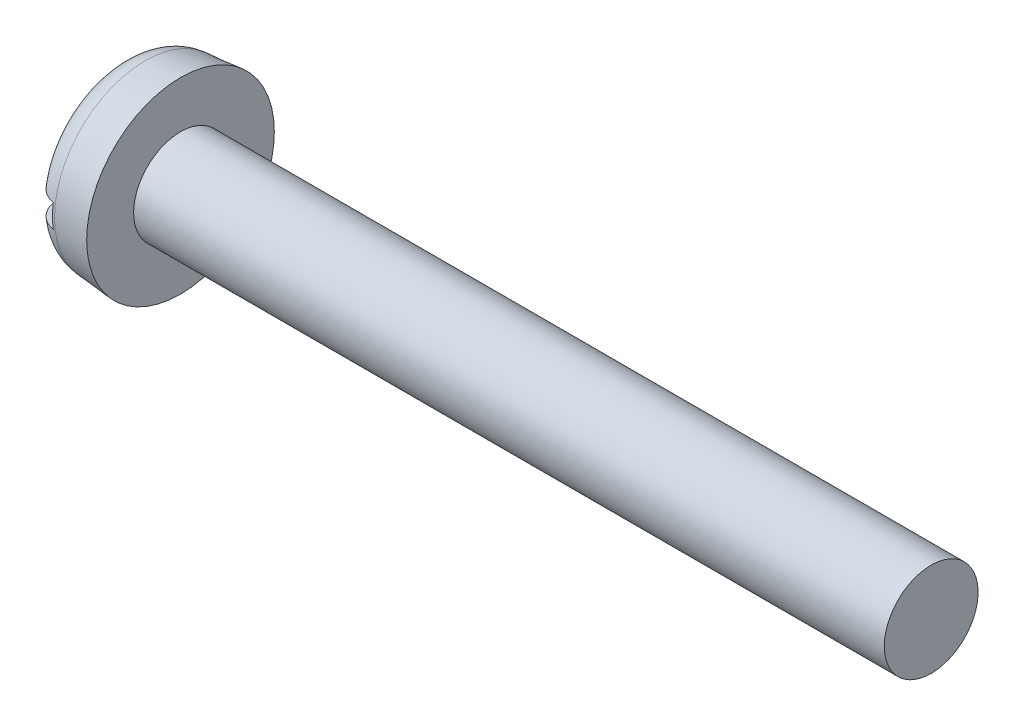
ISO-10303-21;
HEADER;
FILE_DESCRIPTION(('STEP AP214'),'2;1');
FILE_NAME('part.step','',(''),(''),'','','');
FILE_SCHEMA(('AUTOMOTIVE_DESIGN { 1 0 10303 214 1 1 1 1 }'));
ENDSEC;
DATA;
#1=APPLICATION_CONTEXT('core data for automotive mechanical design processes');
#2=APPLICATION_PROTOCOL_DEFINITION('international standard','automotive_design',2000,#1);
#3=PRODUCT_CONTEXT('',#1,'mechanical');
#4=PRODUCT('Part','Part','',(#3));
#5=PRODUCT_RELATED_PRODUCT_CATEGORY('part','',(#4));
#6=PRODUCT_DEFINITION_FORMATION('','',#4);
#7=PRODUCT_DEFINITION_CONTEXT('part definition',#1,'design');
#8=PRODUCT_DEFINITION('design','',#6,#7);
#9=PRODUCT_DEFINITION_SHAPE('','',#8);
#10=(LENGTH_UNIT() NAMED_UNIT(*) SI_UNIT(.MILLI.,.METRE.));
#11=(NAMED_UNIT(*) PLANE_ANGLE_UNIT() SI_UNIT($,.RADIAN.));
#12=(NAMED_UNIT(*) SI_UNIT($,.STERADIAN.) SOLID_ANGLE_UNIT());
#13=UNCERTAINTY_MEASURE_WITH_UNIT(LENGTH_MEASURE(1.E-05),#10,'distance_accuracy_value','');
#14=(GEOMETRIC_REPRESENTATION_CONTEXT(3) GLOBAL_UNCERTAINTY_ASSIGNED_CONTEXT((#13)) GLOBAL_UNIT_ASSIGNED_CONTEXT((#10,
#11,#12)) REPRESENTATION_CONTEXT('',''));
#15=CARTESIAN_POINT('',(0.,0.,0.));
#16=DIRECTION('',(0.,0.,1.));
#17=DIRECTION('',(1.,0.,0.));
#18=AXIS2_PLACEMENT_3D('',#15,#16,#17);
#19=CARTESIAN_POINT('',(0.,0.,0.));
#20=DIRECTION('',(-1.,0.,0.));
#21=DIRECTION('',(0.,0.,1.));
#22=AXIS2_PLACEMENT_3D('',#19,#20,#21);
#23=PLANE('',#22);
#24=DIRECTION('',(0.,0.,-1.));
#25=VECTOR('',#24,1.);
#26=CARTESIAN_POINT('',(0.,0.25,2.));
#27=LINE('',#26,#25);
#28=CARTESIAN_POINT('',(0.,0.25,1.3128752634498));
#29=VERTEX_POINT('',#28);
#30=CARTESIAN_POINT('',(0.,0.25,-1.3128752634498));
#31=VERTEX_POINT('',#30);
#32=EDGE_CURVE('E87',#29,#31,#27,.T.);
#33=ORIENTED_EDGE('',*,*,#32,.F.);
#34=CARTESIAN_POINT('',(0.,0.,0.));
#35=DIRECTION('',(-1.,0.,0.));
#36=DIRECTION('',(0.,0.,1.));
#37=AXIS2_PLACEMENT_3D('',#34,#35,#36);
#38=CIRCLE('',#37,1.33646603300584);
#39=EDGE_CURVE('E93',#29,#31,#38,.T.);
#40=ORIENTED_EDGE('',*,*,#39,.T.);
#41=EDGE_LOOP('',(#33,#40));
#42=FACE_BOUND('',#41,.T.);
#43=ADVANCED_FACE('F34',(#42),#23,.T.);
#44=CARTESIAN_POINT('',(-25.4,0.,0.));
#45=DIRECTION('',(-1.,0.,0.));
#46=DIRECTION('',(0.,0.,1.));
#47=AXIS2_PLACEMENT_3D('',#44,#45,#46);
#48=CYLINDRICAL_SURFACE('',#47,1.);
#49=CARTESIAN_POINT('',(17.3,0.,0.));
#50=DIRECTION('',(-1.,0.,0.));
#51=DIRECTION('',(0.,0.,1.));
#52=AXIS2_PLACEMENT_3D('',#49,#50,#51);
#53=CIRCLE('',#52,1.);
#54=CARTESIAN_POINT('',(17.3,0.,1.));
#55=VERTEX_POINT('',#54);
#56=EDGE_CURVE('E94',#55,#55,#53,.T.);
#57=ORIENTED_EDGE('',*,*,#56,.T.);
#58=EDGE_LOOP('',(#57));
#59=FACE_BOUND('',#58,.T.);
#60=CARTESIAN_POINT('',(1.3,0.,0.));
#61=DIRECTION('',(-1.,0.,0.));
#62=DIRECTION('',(0.,0.,1.));
#63=AXIS2_PLACEMENT_3D('',#60,#61,#62);
#64=CIRCLE('',#63,1.);
#65=CARTESIAN_POINT('',(1.3,0.,1.));
#66=VERTEX_POINT('',#65);
#67=EDGE_CURVE('E151',#66,#66,#64,.T.);
#68=ORIENTED_EDGE('',*,*,#67,.F.);
#69=EDGE_LOOP('',(#68));
#70=FACE_BOUND('',#69,.T.);
#71=ADVANCED_FACE('F139',(#59,#70),#48,.T.);
#72=CARTESIAN_POINT('',(17.3,1.,0.));
#73=DIRECTION('',(1.,0.,0.));
#74=DIRECTION('',(0.,0.,-1.));
#75=AXIS2_PLACEMENT_3D('',#72,#73,#74);
#76=PLANE('',#75);
#77=ORIENTED_EDGE('',*,*,#56,.F.);
#78=EDGE_LOOP('',(#77));
#79=FACE_BOUND('',#78,.T.);
#80=ADVANCED_FACE('F137',(#79),#76,.T.);
#81=DIRECTION('',(0.,0.,1.));
#82=VECTOR('',#81,1.);
#83=CARTESIAN_POINT('',(0.,-0.25,-2.));
#84=LINE('',#83,#82);
#85=CARTESIAN_POINT('',(0.,-0.25,-1.3128752634498));
#86=VERTEX_POINT('',#85);
#87=CARTESIAN_POINT('',(0.,-0.25,1.3128752634498));
#88=VERTEX_POINT('',#87);
#89=EDGE_CURVE('E78',#86,#88,#84,.T.);
#90=ORIENTED_EDGE('',*,*,#89,.F.);
#91=EDGE_CURVE('E85',#86,#88,#38,.T.);
#92=ORIENTED_EDGE('',*,*,#91,.T.);
#93=EDGE_LOOP('',(#90,#92));
#94=FACE_BOUND('',#93,.T.);
#95=ADVANCED_FACE('F84',(#94),#23,.T.);
#96=CARTESIAN_POINT('',(0.,0.,0.));
#97=DIRECTION('',(1.,0.,0.));
#98=DIRECTION('',(0.,0.,-1.));
#99=AXIS2_PLACEMENT_3D('',#96,#97,#98);
#100=CONICAL_SURFACE('',#99,1.8862647374163,0.0872664625997168);
#101=CARTESIAN_POINT('',(0.547706554351407,0.,0.));
#102=DIRECTION('',(-1.,0.,0.));
#103=DIRECTION('',(0.,0.,1.));
#104=AXIS2_PLACEMENT_3D('',#101,#102,#103);
#105=CIRCLE('',#104,1.93418285186089);
#106=CARTESIAN_POINT('',(0.547706554351407,0.,1.93418285186089));
#107=VERTEX_POINT('',#106);
#108=EDGE_CURVE('E97',#107,#107,#105,.F.);
#109=ORIENTED_EDGE('',*,*,#108,.T.);
#110=EDGE_LOOP('',(#109));
#111=FACE_BOUND('',#110,.T.);
#112=CARTESIAN_POINT('',(1.3,0.,0.));
#113=DIRECTION('',(-1.,0.,0.));
#114=DIRECTION('',(0.,0.,1.));
#115=AXIS2_PLACEMENT_3D('',#112,#113,#114);
#116=CIRCLE('',#115,2.);
#117=CARTESIAN_POINT('',(1.3,0.,2.));
#118=VERTEX_POINT('',#117);
#119=EDGE_CURVE('E99',#118,#118,#116,.T.);
#120=ORIENTED_EDGE('',*,*,#119,.T.);
#121=EDGE_LOOP('',(#120));
#122=FACE_BOUND('',#121,.T.);
#123=ADVANCED_FACE('F130',(#111,#122),#100,.T.);
#124=CARTESIAN_POINT('',(1.3,1.,0.));
#125=DIRECTION('',(-1.,0.,0.));
#126=DIRECTION('',(0.,0.,1.));
#127=AXIS2_PLACEMENT_3D('',#124,#125,#126);
#128=PLANE('',#127);
#129=ORIENTED_EDGE('',*,*,#119,.F.);
#130=EDGE_LOOP('',(#129));
#131=FACE_BOUND('',#130,.T.);
#132=ORIENTED_EDGE('',*,*,#67,.T.);
#133=EDGE_LOOP('',(#132));
#134=FACE_BOUND('',#133,.T.);
#135=ADVANCED_FACE('F126',(#131,#134),#128,.F.);
#136=CARTESIAN_POINT('',(0.6,0.,0.));
#137=DIRECTION('',(-1.,0.,0.));
#138=DIRECTION('',(0.,0.,1.));
#139=AXIS2_PLACEMENT_3D('',#136,#137,#138);
#140=TOROIDAL_SURFACE('',#139,1.33646603300584,0.6);
#141=CARTESIAN_POINT('',(0.274780655200361,0.25,-1.82362420667529));
#142=CARTESIAN_POINT('',(0.302850124065662,0.25,-1.84189666141675));
#143=CARTESIAN_POINT('',(0.332476912836235,0.25,-1.85782010480749));
#144=CARTESIAN_POINT('',(0.394006386294874,0.25,-1.8844828387307));
#145=CARTESIAN_POINT('',(0.425911622330593,0.25,-1.89521620967586));
#146=CARTESIAN_POINT('',(0.49106542171139,0.25,-1.91116335358415));
#147=CARTESIAN_POINT('',(0.524313546486278,0.25,-1.91637891370101));
#148=CARTESIAN_POINT('',(0.591204792683812,0.25,-1.92113959303415));
#149=CARTESIAN_POINT('',(0.624847818162146,0.25,-1.92068606223462));
#150=CARTESIAN_POINT('',(0.691513871966761,0.25,-1.91413229696864));
#151=CARTESIAN_POINT('',(0.724537965843794,0.25,-1.90804289638476));
#152=CARTESIAN_POINT('',(0.789097481854443,0.25,-1.89041111372299));
#153=CARTESIAN_POINT('',(0.820632856008674,0.25,-1.87886855602915));
#154=CARTESIAN_POINT('',(0.881355504744871,0.25,-1.85065407323916));
#155=CARTESIAN_POINT('',(0.910540461536868,0.25,-1.8339771613426));
#156=CARTESIAN_POINT('',(0.965713973197687,0.25,-1.7959832160475));
#157=CARTESIAN_POINT('',(0.991702483157432,0.25,-1.77466611746743));
#158=CARTESIAN_POINT('',(1.03989067692429,0.25,-1.72788939986325));
#159=CARTESIAN_POINT('',(1.06207077173726,0.25,-1.70240960587084));
#160=CARTESIAN_POINT('',(1.10188385808005,0.25,-1.64811708765422));
#161=CARTESIAN_POINT('',(1.11951669564412,0.25,-1.61930425062421));
#162=CARTESIAN_POINT('',(1.14991644324992,0.25,-1.55888388907361));
#163=CARTESIAN_POINT('',(1.16263701266532,0.25,-1.52725305653232));
#164=CARTESIAN_POINT('',(1.18266472006596,0.25,-1.46232290586992));
#165=CARTESIAN_POINT('',(1.18997153304379,0.25,-1.42902348770568));
#166=CARTESIAN_POINT('',(1.1990757467124,0.25,-1.36122512528321));
#167=CARTESIAN_POINT('',(1.2007978533932,0.25,-1.3267160782536));
#168=CARTESIAN_POINT('',(1.19852158611446,0.25,-1.25788795964169));
#169=CARTESIAN_POINT('',(1.19452272743365,0.25,-1.22356890440419));
#170=CARTESIAN_POINT('',(1.18084584012593,0.25,-1.15550299104831));
#171=CARTESIAN_POINT('',(1.1710768980116,0.25,-1.12177439719896));
#172=CARTESIAN_POINT('',(1.14608963326822,0.25,-1.05639845281472));
#173=CARTESIAN_POINT('',(1.13087072283895,0.25,-1.02475132721021));
#174=CARTESIAN_POINT('',(1.09517672424942,0.25,-0.964015185217591));
#175=CARTESIAN_POINT('',(1.07463585116154,0.25,-0.934964791126672));
#176=CARTESIAN_POINT('',(1.0289468611237,0.25,-0.880736843040393));
#177=CARTESIAN_POINT('',(1.00379831827947,0.25,-0.855559647447028));
#178=CARTESIAN_POINT('',(0.949690395648163,0.25,-0.809995267822458));
#179=CARTESIAN_POINT('',(0.920750663668051,0.25,-0.789584802369704));
#180=CARTESIAN_POINT('',(0.859743350231912,0.25,-0.754142685467499));
#181=CARTESIAN_POINT('',(0.827676707896818,0.25,-0.739109425347756));
#182=CARTESIAN_POINT('',(0.762667368563303,0.25,-0.715550940340569));
#183=CARTESIAN_POINT('',(0.729809776019389,0.25,-0.706791374099582));
#184=CARTESIAN_POINT('',(0.663065073704784,0.25,-0.695254567880968));
#185=CARTESIAN_POINT('',(0.629178416423444,0.25,-0.69247473610395));
#186=CARTESIAN_POINT('',(0.563211392329523,0.25,-0.693020234763517));
#187=CARTESIAN_POINT('',(0.531128042957495,0.25,-0.696037951412193));
#188=CARTESIAN_POINT('',(0.467930020079841,0.25,-0.707432616918485));
#189=CARTESIAN_POINT('',(0.436815388934093,0.25,-0.715809799789358));
#190=CARTESIAN_POINT('',(0.376446381647119,0.25,-0.737546549416802));
#191=CARTESIAN_POINT('',(0.347188974627552,0.25,-0.750897740765059));
#192=CARTESIAN_POINT('',(0.29118144985243,0.25,-0.782096393740082));
#193=CARTESIAN_POINT('',(0.264431855473699,0.25,-0.799944791073732));
#194=CARTESIAN_POINT('',(0.21280112205241,0.25,-0.840563479123866));
#195=CARTESIAN_POINT('',(0.18807630516109,0.25,-0.863532471122662));
#196=CARTESIAN_POINT('',(0.142632089074548,0.25,-0.913140155498345));
#197=CARTESIAN_POINT('',(0.121913544381091,0.25,-0.939779628685344));
#198=CARTESIAN_POINT('',(0.0841798141603359,0.25,-0.997238681509955));
#199=CARTESIAN_POINT('',(0.0673637911083437,0.25,-1.02818930073671));
#200=CARTESIAN_POINT('',(0.0390991703503447,0.25,-1.09245311591645));
#201=CARTESIAN_POINT('',(0.0276510234354346,0.25,-1.12576651002353));
#202=CARTESIAN_POINT('',(0.0103722361801808,0.25,-1.19421384118873));
#203=CARTESIAN_POINT('',(0.00460478662294662,0.25,-1.2293637757047));
#204=CARTESIAN_POINT('',(-0.000878679151094756,0.25,-1.30013265464533));
#205=CARTESIAN_POINT('',(-0.000595165424060245,0.25,-1.33575156242399));
#206=CARTESIAN_POINT('',(0.00602927957051808,0.25,-1.40603493785938));
#207=CARTESIAN_POINT('',(0.0123048116822737,0.25,-1.44070555722832));
#208=CARTESIAN_POINT('',(0.0306887868415261,0.25,-1.50847558350848));
#209=CARTESIAN_POINT('',(0.0427982176917193,0.25,-1.54157472329189));
#210=CARTESIAN_POINT('',(0.0722935157774218,0.25,-1.60468559872415));
#211=CARTESIAN_POINT('',(0.089592245738643,0.25,-1.63473812116026));
#212=CARTESIAN_POINT('',(0.129048154505429,0.25,-1.6914266708082));
#213=CARTESIAN_POINT('',(0.151198946684604,0.25,-1.71806711686356));
#214=CARTESIAN_POINT('',(0.190498702041562,0.25,-1.75782741941758));
#215=CARTESIAN_POINT('',(0.206359023192159,0.25,-1.77224346176931));
#216=CARTESIAN_POINT('',(0.23952762918078,0.25,-1.79930107726038));
#217=CARTESIAN_POINT('',(0.256835902453732,0.25,-1.81194266457048));
#218=CARTESIAN_POINT('',(0.274780655200361,0.25,-1.82362420667529));
#219=B_SPLINE_CURVE_WITH_KNOTS('',3,(#141,#142,#143,#144,#145,#146,#147,#148,#149,#150,#151,
#152,#153,#154,#155,#156,#157,#158,#159,#160,#161,#162,#163,#164,#165,#166,#167,#168,#169,#170,
#171,#172,#173,#174,#175,#176,#177,#178,#179,#180,#181,#182,#183,#184,#185,#186,#187,#188,#189,
#190,#191,#192,#193,#194,#195,#196,#197,#198,#199,#200,#201,#202,#203,#204,#205,#206,#207,#208,
#209,#210,#211,#212,#213,#214,#215,#216,#217,#218),.UNSPECIFIED.,.T.,.F.,(4,2,2,2,2,2,2,2,2,2,2,
2,2,2,2,2,2,2,2,2,2,2,2,2,2,2,2,2,2,2,2,2,2,2,2,2,2,2,4),(0.,0.100401062182578,
0.200916369230917,0.301399110583017,0.401857924372673,0.502124025494567,0.602393355851687,
0.70276038283154,0.80312881977564,0.903998978686786,1.00487255251616,1.10667574998262,
1.20848505856888,1.31166139334771,1.41484647048427,1.5197024094854,1.62456966101414,
1.73080076101002,1.83704168507411,1.94275232230141,2.04843130812937,2.14992147627128,
2.25136764660652,2.34757938832311,2.44379533127149,2.53984998938428,2.6359246495452,
2.73671855873459,2.83753394270023,2.9427139364961,3.04790276166498,3.1542488966228,
3.26058677033834,3.36577714242787,3.4709853317399,3.57451735589247,3.67791391414109,
3.74210061585798,3.8062868049523),.UNSPECIFIED.);
#220=CARTESIAN_POINT('',(0.5,0.25,-1.91179742470572));
#221=VERTEX_POINT('',#220);
#222=EDGE_CURVE('E11',#31,#221,#219,.T.);
#223=ORIENTED_EDGE('',*,*,#222,.F.);
#224=ORIENTED_EDGE('',*,*,#39,.F.);
#225=CARTESIAN_POINT('',(0.25647797126752,0.25,0.806687931408376));
#226=CARTESIAN_POINT('',(0.283073772587687,0.25,0.787245268924266));
#227=CARTESIAN_POINT('',(0.311256734673757,0.25,0.769944535846651));
#228=CARTESIAN_POINT('',(0.370114008258176,0.25,0.740229039319213));
#229=CARTESIAN_POINT('',(0.400789824440839,0.25,0.727817253657524));
#230=CARTESIAN_POINT('',(0.463871915221717,0.25,0.708374903085697));
#231=CARTESIAN_POINT('',(0.496281146765579,0.25,0.701353868838656));
#232=CARTESIAN_POINT('',(0.561820079529305,0.25,0.693064165401108));
#233=CARTESIAN_POINT('',(0.594949507008968,0.25,0.691793347727689));
#234=CARTESIAN_POINT('',(0.65986859958071,0.25,0.695008568960631));
#235=CARTESIAN_POINT('',(0.691667437306452,0.25,0.699313344775918));
#236=CARTESIAN_POINT('',(0.754098929301161,0.25,0.713169938820386));
#237=CARTESIAN_POINT('',(0.784731434429555,0.25,0.722722425688242));
#238=CARTESIAN_POINT('',(0.844220886452172,0.25,0.746760750983483));
#239=CARTESIAN_POINT('',(0.873064893626733,0.25,0.761278483323786));
#240=CARTESIAN_POINT('',(0.928072070248523,0.25,0.794719206207592));
#241=CARTESIAN_POINT('',(0.954234673131182,0.25,0.813643124999441));
#242=CARTESIAN_POINT('',(1.00455764012357,0.25,0.856403426025716));
#243=CARTESIAN_POINT('',(1.02854601727969,0.25,0.880442281861904));
#244=CARTESIAN_POINT('',(1.07233969055911,0.25,0.93206911063745));
#245=CARTESIAN_POINT('',(1.09214414470062,0.25,0.959657796158255));
#246=CARTESIAN_POINT('',(1.1277806057224,0.25,1.01880991735135));
#247=CARTESIAN_POINT('',(1.14342273788476,0.25,1.05048797462787));
#248=CARTESIAN_POINT('',(1.16921417457241,0.25,1.11600811372881));
#249=CARTESIAN_POINT('',(1.17936312023956,0.25,1.14985033677212));
#250=CARTESIAN_POINT('',(1.19390640883483,0.25,1.21901855241697));
#251=CARTESIAN_POINT('',(1.198256990977,0.25,1.25435377468586));
#252=CARTESIAN_POINT('',(1.20088701701162,0.25,1.32525082928571));
#253=CARTESIAN_POINT('',(1.19916675302153,0.25,1.36081265063096));
#254=CARTESIAN_POINT('',(1.18971168250471,0.25,1.43069187166979));
#255=CARTESIAN_POINT('',(1.18204966947663,0.25,1.46501910735442));
#256=CARTESIAN_POINT('',(1.16097413489613,0.25,1.53186104297244));
#257=CARTESIAN_POINT('',(1.14756110125118,0.25,1.5643758964011));
#258=CARTESIAN_POINT('',(1.11560510746244,0.25,1.62610187095566));
#259=CARTESIAN_POINT('',(1.097149951566,0.25,1.65535845455428));
#260=CARTESIAN_POINT('',(1.05552533497899,0.25,1.71030063892362));
#261=CARTESIAN_POINT('',(1.03235623843943,0.25,1.73598651527295));
#262=CARTESIAN_POINT('',(0.982310027591305,0.25,1.78268807238429));
#263=CARTESIAN_POINT('',(0.955488368089889,0.25,1.80376319341113));
#264=CARTESIAN_POINT('',(0.898659765129522,0.25,1.8410604546949));
#265=CARTESIAN_POINT('',(0.868652997996469,0.25,1.85728286340582));
#266=CARTESIAN_POINT('',(0.806611342278962,0.25,1.88426128245479));
#267=CARTESIAN_POINT('',(0.774598152543608,0.25,1.89506720989169));
#268=CARTESIAN_POINT('',(0.709207275735754,0.25,1.91112053581599));
#269=CARTESIAN_POINT('',(0.67582963400342,0.25,1.91636811884914));
#270=CARTESIAN_POINT('',(0.608837656027687,0.25,1.92113717337632));
#271=CARTESIAN_POINT('',(0.575225363311112,0.25,1.92068739829934));
#272=CARTESIAN_POINT('',(0.508554909070377,0.25,1.91414489858889));
#273=CARTESIAN_POINT('',(0.475496740593514,0.25,1.90805224481175));
#274=CARTESIAN_POINT('',(0.410905076842549,0.25,1.89041194259857));
#275=CARTESIAN_POINT('',(0.379370111612107,0.25,1.87886967409414));
#276=CARTESIAN_POINT('',(0.318677746934266,0.25,1.85066978427311));
#277=CARTESIAN_POINT('',(0.289520360090016,0.25,1.83401213584294));
#278=CARTESIAN_POINT('',(0.234312878154215,0.25,1.79600861494103));
#279=CARTESIAN_POINT('',(0.20827228119735,0.25,1.77464894819558));
#280=CARTESIAN_POINT('',(0.160116194508203,0.25,1.72788872147726));
#281=CARTESIAN_POINT('',(0.13800080840638,0.25,1.70248805485052));
#282=CARTESIAN_POINT('',(0.0981483460954305,0.25,1.64818018628309));
#283=CARTESIAN_POINT('',(0.0804433545930309,0.25,1.61924944626991));
#284=CARTESIAN_POINT('',(0.0500800334875073,0.25,1.55885213954979));
#285=CARTESIAN_POINT('',(0.0374219573508648,0.25,1.52738544557741));
#286=CARTESIAN_POINT('',(0.0173499908938403,0.25,1.46242951274809));
#287=CARTESIAN_POINT('',(0.00999744820991976,0.25,1.42892132543473));
#288=CARTESIAN_POINT('',(0.000932027792608534,0.25,1.36115298475673));
#289=CARTESIAN_POINT('',(-0.000780662751594845,0.25,1.32689280647116));
#290=CARTESIAN_POINT('',(0.00145026647964888,0.25,1.25804055944597));
#291=CARTESIAN_POINT('',(0.00547954732126168,0.25,1.22345127364072));
#292=CARTESIAN_POINT('',(0.0191955913899645,0.25,1.15540432623591));
#293=CARTESIAN_POINT('',(0.0288841889000252,0.25,1.12194703525683));
#294=CARTESIAN_POINT('',(0.0538243357846501,0.25,1.05655247440412));
#295=CARTESIAN_POINT('',(0.0691636585180377,0.25,1.02464870679869));
#296=CARTESIAN_POINT('',(0.104937128864068,0.25,0.963866007236644));
#297=CARTESIAN_POINT('',(0.125366421619971,0.25,0.934984229941663));
#298=CARTESIAN_POINT('',(0.164028944144066,0.25,0.889058344229296));
#299=CARTESIAN_POINT('',(0.181121312132095,0.25,0.87104130385289));
#300=CARTESIAN_POINT('',(0.217335307543651,0.25,0.837174222613301));
#301=CARTESIAN_POINT('',(0.236456923370607,0.25,0.821324169367588));
#302=CARTESIAN_POINT('',(0.25647797126752,0.25,0.806687931408376));
#303=B_SPLINE_CURVE_WITH_KNOTS('',3,(#225,#226,#227,#228,#229,#230,#231,#232,#233,#234,#235,
#236,#237,#238,#239,#240,#241,#242,#243,#244,#245,#246,#247,#248,#249,#250,#251,#252,#253,#254,
#255,#256,#257,#258,#259,#260,#261,#262,#263,#264,#265,#266,#267,#268,#269,#270,#271,#272,#273,
#274,#275,#276,#277,#278,#279,#280,#281,#282,#283,#284,#285,#286,#287,#288,#289,#290,#291,#292,
#293,#294,#295,#296,#297,#298,#299,#300,#301,#302),.UNSPECIFIED.,.T.,.F.,(4,2,2,2,2,2,2,2,2,2,2,
2,2,2,2,2,2,2,2,2,2,2,2,2,2,2,2,2,2,2,2,2,2,2,2,2,2,2,4),(0.,0.0987501477700194,
0.19756035018262,0.296544845923676,0.39549235452428,0.491302394396121,0.587124644765227,
0.68357433728144,0.780044367203688,0.881471955879884,0.9829199366625,1.08841286316154,
1.19391268045661,1.30020428911123,1.40649078328765,1.51149532344498,1.61649095694569,
1.71976342015201,1.82302790860739,1.92487039176505,2.02670723991341,2.12758748528433,
2.22846438116773,2.32883237519779,2.42919910894713,2.52946696584731,2.62973535421627,
2.73030191514127,2.83087113075401,2.93215189853696,3.03343775220811,3.13587677944123,
3.23831920663671,3.34230600671742,3.44632652944514,3.5520360732953,3.65764517390562,
3.73198370247418,3.80632180624214),.UNSPECIFIED.);
#304=CARTESIAN_POINT('',(0.5,0.25,1.91179742470572));
#305=VERTEX_POINT('',#304);
#306=EDGE_CURVE('E111',#305,#29,#303,.T.);
#307=ORIENTED_EDGE('',*,*,#306,.F.);
#308=CARTESIAN_POINT('',(0.5,0.,0.));
#309=DIRECTION('',(-1.,0.,0.));
#310=DIRECTION('',(0.,0.,1.));
#311=AXIS2_PLACEMENT_3D('',#308,#309,#310);
#312=CIRCLE('',#311,1.92807401131581);
#313=CARTESIAN_POINT('',(0.5,-0.25,1.91179742470572));
#314=VERTEX_POINT('',#313);
#315=EDGE_CURVE('E105',#305,#314,#312,.F.);
#316=ORIENTED_EDGE('',*,*,#315,.T.);
#317=CARTESIAN_POINT('',(0.25647797126752,-0.25,0.806687931408376));
#318=CARTESIAN_POINT('',(0.22811461508231,-0.25,0.827425620219486));
#319=CARTESIAN_POINT('',(0.201516055297732,-0.25,0.850630894293789));
#320=CARTESIAN_POINT('',(0.152571331977692,-0.25,0.901208782716564));
#321=CARTESIAN_POINT('',(0.130232677758372,-0.25,0.928588605834286));
#322=CARTESIAN_POINT('',(0.0904534192406148,-0.25,0.986651718459008));
#323=CARTESIAN_POINT('',(0.0730064503192135,-0.25,1.0173306428444));
#324=CARTESIAN_POINT('',(0.043460232946248,-0.25,1.08114792064194));
#325=CARTESIAN_POINT('',(0.0313588569417123,-0.25,1.11428528944574));
#326=CARTESIAN_POINT('',(0.0127636490885255,-0.25,1.1824429151294));
#327=CARTESIAN_POINT('',(0.00632467814466838,-0.25,1.21747817526152));
#328=CARTESIAN_POINT('',(-0.000517283901222732,-0.25,1.28813764188796));
#329=CARTESIAN_POINT('',(-0.000920002337641562,-0.25,1.3237618749142));
#330=CARTESIAN_POINT('',(0.00434800778750714,-0.25,1.39420239184286));
#331=CARTESIAN_POINT('',(0.00995817056286334,-0.25,1.42902319077614));
#332=CARTESIAN_POINT('',(0.0270441493196888,-0.25,1.49719541380208));
#333=CARTESIAN_POINT('',(0.0385194335615698,-0.25,1.53054697080046));
#334=CARTESIAN_POINT('',(0.0668053333263151,-0.25,1.59425150405687));
#335=CARTESIAN_POINT('',(0.0835255252196934,-0.25,1.62464463268788));
#336=CARTESIAN_POINT('',(0.121902514595008,-0.25,1.6821361772215));
#337=CARTESIAN_POINT('',(0.143558907828022,-0.25,1.70923486264318));
#338=CARTESIAN_POINT('',(0.190851277951756,-0.25,1.75895715118281));
#339=CARTESIAN_POINT('',(0.216425242565036,-0.25,1.78163974924995));
#340=CARTESIAN_POINT('',(0.271051715066319,-0.25,1.82233619463279));
#341=CARTESIAN_POINT('',(0.300104021127431,-0.25,1.84035031264008));
#342=CARTESIAN_POINT('',(0.360541640657975,-0.25,1.87101228101318));
#343=CARTESIAN_POINT('',(0.391900202395491,-0.25,1.88371287767629));
#344=CARTESIAN_POINT('',(0.456312001468162,-0.25,1.90363448924139));
#345=CARTESIAN_POINT('',(0.489365175345782,-0.25,1.91085570916788));
#346=CARTESIAN_POINT('',(0.556022772858472,-0.25,1.91957878374415));
#347=CARTESIAN_POINT('',(0.589622905521806,-0.25,1.92111345806165));
#348=CARTESIAN_POINT('',(0.656602284044621,-0.25,1.91850953421242));
#349=CARTESIAN_POINT('',(0.689981533445374,-0.25,1.9143710272225));
#350=CARTESIAN_POINT('',(0.755513913993921,-0.25,1.9005544490505));
#351=CARTESIAN_POINT('',(0.787669009716197,-0.25,1.89088569056007));
#352=CARTESIAN_POINT('',(0.849904715559474,-0.25,1.86629884137169));
#353=CARTESIAN_POINT('',(0.879985320055665,-0.25,1.85138073644125));
#354=CARTESIAN_POINT('',(0.937296248504193,-0.25,1.81668982088819));
#355=CARTESIAN_POINT('',(0.964519921503605,-0.25,1.79690602558855));
#356=CARTESIAN_POINT('',(1.01528516641715,-0.25,1.75307523190286));
#357=CARTESIAN_POINT('',(1.03882665732028,-0.25,1.72902813974565));
#358=CARTESIAN_POINT('',(1.08172595916947,-0.25,1.67719606185349));
#359=CARTESIAN_POINT('',(1.10105627962252,-0.25,1.64938832937458));
#360=CARTESIAN_POINT('',(1.13482995867941,-0.25,1.5909499281355));
#361=CARTESIAN_POINT('',(1.1492731095708,-0.25,1.56031913946136));
#362=CARTESIAN_POINT('',(1.17303442993066,-0.25,1.49675978182125));
#363=CARTESIAN_POINT('',(1.18229654757927,-0.25,1.46381026645167));
#364=CARTESIAN_POINT('',(1.19524406921989,-0.25,1.39683436474365));
#365=CARTESIAN_POINT('',(1.19892909236176,-0.25,1.36280790502451));
#366=CARTESIAN_POINT('',(1.2006801090878,-0.25,1.29411335821481));
#367=CARTESIAN_POINT('',(1.19866316593094,-0.25,1.25944316342795));
#368=CARTESIAN_POINT('',(1.18893397437426,-0.25,1.19091174344461));
#369=CARTESIAN_POINT('',(1.18122120940792,-0.25,1.15705059190959));
#370=CARTESIAN_POINT('',(1.1601769908767,-0.25,1.09051812196973));
#371=CARTESIAN_POINT('',(1.14675676173025,-0.25,1.05787487044025));
#372=CARTESIAN_POINT('',(1.11467775754884,-0.25,0.995269036554544));
#373=CARTESIAN_POINT('',(1.09601835733878,-0.25,0.965306774676047));
#374=CARTESIAN_POINT('',(1.05376852779922,-0.25,0.908648094512249));
#375=CARTESIAN_POINT('',(1.03013402245569,-0.25,0.881984499365601));
#376=CARTESIAN_POINT('',(0.978662413228472,-0.25,0.833068820610378));
#377=CARTESIAN_POINT('',(0.950825230537788,-0.25,0.810816819744432));
#378=CARTESIAN_POINT('',(0.892141273449015,-0.25,0.771800498870371));
#379=CARTESIAN_POINT('',(0.861346635725293,-0.25,0.754957957909245));
#380=CARTESIAN_POINT('',(0.797264463313657,-0.25,0.726991035263802));
#381=CARTESIAN_POINT('',(0.763978152414699,-0.25,0.715863867305707));
#382=CARTESIAN_POINT('',(0.697614354203181,-0.25,0.700248790529691));
#383=CARTESIAN_POINT('',(0.66460756742684,-0.25,0.69546044216975));
#384=CARTESIAN_POINT('',(0.598260395579763,-0.25,0.691762050694227));
#385=CARTESIAN_POINT('',(0.564920014690449,-0.25,0.692851933990089));
#386=CARTESIAN_POINT('',(0.500305713906346,-0.25,0.700686922928174));
#387=CARTESIAN_POINT('',(0.46900300241209,-0.25,0.707199303446527));
#388=CARTESIAN_POINT('',(0.407926960128377,-0.25,0.725286338726901));
#389=CARTESIAN_POINT('',(0.378151979755174,-0.25,0.736855399235375));
#390=CARTESIAN_POINT('',(0.333202955789929,-0.25,0.75861828709463));
#391=CARTESIAN_POINT('',(0.317258156054092,-0.25,0.767262590798233));
#392=CARTESIAN_POINT('',(0.286211704034722,-0.25,0.785948392377952));
#393=CARTESIAN_POINT('',(0.271110004852099,-0.25,0.795989812428051));
#394=CARTESIAN_POINT('',(0.25647797126752,-0.25,0.806687931408376));
#395=B_SPLINE_CURVE_WITH_KNOTS('',3,(#317,#318,#319,#320,#321,#322,#323,#324,#325,#326,#327,
#328,#329,#330,#331,#332,#333,#334,#335,#336,#337,#338,#339,#340,#341,#342,#343,#344,#345,#346,
#347,#348,#349,#350,#351,#352,#353,#354,#355,#356,#357,#358,#359,#360,#361,#362,#363,#364,#365,
#366,#367,#368,#369,#370,#371,#372,#373,#374,#375,#376,#377,#378,#379,#380,#381,#382,#383,#384,
#385,#386,#387,#388,#389,#390,#391,#392,#393,#394),.UNSPECIFIED.,.T.,.F.,(4,2,2,2,2,2,2,2,2,2,2,
2,2,2,2,2,2,2,2,2,2,2,2,2,2,2,2,2,2,2,2,2,2,2,2,2,2,2,4),(0.,0.105339517541497,
0.210863043847173,0.316248628408819,0.421592231495568,0.527945567697215,0.634303708007108,
0.739600518645185,0.8448877846295,0.948451329469218,1.05200639604478,1.1540654205465,
1.25611852605422,1.35713304654448,1.45814378713888,1.55857063213837,1.65899586314173,
1.75925247843266,1.85950936555035,1.95999470219394,2.06048224928579,2.16160732902587,
2.2627367062024,2.36493999460764,2.46715026198412,2.57085482340577,2.67456879117567,
2.77995861689427,2.88536102382396,2.9917397945569,3.09812056031159,3.20288545926039,
3.30759923619073,3.40714743935949,3.50669439630456,3.60217675632204,3.69755374960456,
3.75189912320181,3.80624147071477),.UNSPECIFIED.);
#396=EDGE_CURVE('E92',#88,#314,#395,.T.);
#397=ORIENTED_EDGE('',*,*,#396,.F.);
#398=ORIENTED_EDGE('',*,*,#91,.F.);
#399=CARTESIAN_POINT('',(0.274780655200361,-0.25,-1.82362420667529));
#400=CARTESIAN_POINT('',(0.246412102452132,-0.25,-1.80515338183894));
#401=CARTESIAN_POINT('',(0.21959244724356,-0.25,-1.78425531890811));
#402=CARTESIAN_POINT('',(0.169833030497775,-0.25,-1.73822266295481));
#403=CARTESIAN_POINT('',(0.146898387228132,-0.25,-1.71308256697065));
#404=CARTESIAN_POINT('',(0.105585790103501,-0.25,-1.6593372656025));
#405=CARTESIAN_POINT('',(0.0872036369512325,-0.25,-1.6307352900536));
#406=CARTESIAN_POINT('',(0.0554631702647639,-0.25,-1.57088061633069));
#407=CARTESIAN_POINT('',(0.0421035983782343,-0.25,-1.539628584507));
#408=CARTESIAN_POINT('',(0.0206432771902915,-0.25,-1.47507749615836));
#409=CARTESIAN_POINT('',(0.0125876254984659,-0.25,-1.44176345508561));
#410=CARTESIAN_POINT('',(0.00209404371654316,-0.25,-1.37426177356359));
#411=CARTESIAN_POINT('',(-0.000343263952376172,-0.25,-1.34007403674719));
#412=CARTESIAN_POINT('',(0.000426825088754777,-0.25,-1.27125045227628));
#413=CARTESIAN_POINT('',(0.00371931456959635,-0.25,-1.23661556247096));
#414=CARTESIAN_POINT('',(0.0159771202394858,-0.25,-1.16836487965491));
#415=CARTESIAN_POINT('',(0.0249429593885403,-0.25,-1.1347491808909));
#416=CARTESIAN_POINT('',(0.0484576079098379,-0.25,-1.06892310437898));
#417=CARTESIAN_POINT('',(0.0630932921348849,-0.25,-1.03674374367566));
#418=CARTESIAN_POINT('',(0.0975178908169313,-0.25,-0.975266378936166));
#419=CARTESIAN_POINT('',(0.117307414846903,-0.25,-0.945968716299347));
#420=CARTESIAN_POINT('',(0.161678775070649,-0.25,-0.890885916345782));
#421=CARTESIAN_POINT('',(0.186295749588469,-0.25,-0.865129042953098));
#422=CARTESIAN_POINT('',(0.239578542918412,-0.25,-0.81820190376519));
#423=CARTESIAN_POINT('',(0.268244266621965,-0.25,-0.797031530258765));
#424=CARTESIAN_POINT('',(0.32827251951993,-0.25,-0.76039601809818));
#425=CARTESIAN_POINT('',(0.359573150112362,-0.25,-0.744829720355555));
#426=CARTESIAN_POINT('',(0.424438831887223,-0.25,-0.719501501346933));
#427=CARTESIAN_POINT('',(0.458002805134312,-0.25,-0.709736838442931));
#428=CARTESIAN_POINT('',(0.524586152437568,-0.25,-0.696826910772117));
#429=CARTESIAN_POINT('',(0.557544486769873,-0.25,-0.693366517126951));
#430=CARTESIAN_POINT('',(0.623554751672406,-0.25,-0.692262369608287));
#431=CARTESIAN_POINT('',(0.656606659486082,-0.25,-0.694617305616992));
#432=CARTESIAN_POINT('',(0.720611933799709,-0.25,-0.704833460708912));
#433=CARTESIAN_POINT('',(0.751597966403628,-0.25,-0.712492488093248));
#434=CARTESIAN_POINT('',(0.811898810445142,-0.25,-0.732772492269664));
#435=CARTESIAN_POINT('',(0.841213363360532,-0.25,-0.745394234257513));
#436=CARTESIAN_POINT('',(0.898189202124164,-0.25,-0.775523337991995));
#437=CARTESIAN_POINT('',(0.925787684286251,-0.25,-0.793149196355938));
#438=CARTESIAN_POINT('',(0.977832434568893,-0.25,-0.83256115323777));
#439=CARTESIAN_POINT('',(1.0022779916631,-0.25,-0.854348187417305));
#440=CARTESIAN_POINT('',(1.04866939922734,-0.25,-0.902723861616108));
#441=CARTESIAN_POINT('',(1.07041372154462,-0.25,-0.929505970910612));
#442=CARTESIAN_POINT('',(1.10925507245311,-0.25,-0.986252581526152));
#443=CARTESIAN_POINT('',(1.12635132905473,-0.25,-1.01621761034511));
#444=CARTESIAN_POINT('',(1.15587826370585,-0.25,-1.07945315539287));
#445=CARTESIAN_POINT('',(1.16815613299896,-0.25,-1.11279518659324));
#446=CARTESIAN_POINT('',(1.18693723838892,-0.25,-1.18106947273944));
#447=CARTESIAN_POINT('',(1.1934403543256,-0.25,-1.2160017607592));
#448=CARTESIAN_POINT('',(1.20044092616513,-0.25,-1.28644113223491));
#449=CARTESIAN_POINT('',(1.20094258611858,-0.25,-1.32194779587657));
#450=CARTESIAN_POINT('',(1.19588430233747,-0.25,-1.39252791212313));
#451=CARTESIAN_POINT('',(1.19032476970293,-0.25,-1.42760139394538));
#452=CARTESIAN_POINT('',(1.17338401955317,-0.25,-1.49576581682077));
#453=CARTESIAN_POINT('',(1.16208963405868,-0.25,-1.52887833044069));
#454=CARTESIAN_POINT('',(1.13401256129969,-0.25,-1.59268937671454));
#455=CARTESIAN_POINT('',(1.11723033304274,-0.25,-1.62338811099263));
#456=CARTESIAN_POINT('',(1.07894820628702,-0.25,-1.6809798631895));
#457=CARTESIAN_POINT('',(1.05752802949783,-0.25,-1.70792588292094));
#458=CARTESIAN_POINT('',(1.01041587459132,-0.25,-1.75778184073562));
#459=CARTESIAN_POINT('',(0.984724190633808,-0.25,-1.78069205652324));
#460=CARTESIAN_POINT('',(0.930145997257693,-0.25,-1.82153088343964));
#461=CARTESIAN_POINT('',(0.901303114330234,-0.25,-1.83951781323057));
#462=CARTESIAN_POINT('',(0.840989444753482,-0.25,-1.87034790500803));
#463=CARTESIAN_POINT('',(0.80951889152929,-0.25,-1.88319152330656));
#464=CARTESIAN_POINT('',(0.745117220679505,-0.25,-1.90327101630393));
#465=CARTESIAN_POINT('',(0.712199973113327,-0.25,-1.91055140172039));
#466=CARTESIAN_POINT('',(0.645600086806313,-0.25,-1.91946097417425));
#467=CARTESIAN_POINT('',(0.611917272957429,-0.25,-1.92108885495024));
#468=CARTESIAN_POINT('',(0.544871876047508,-0.25,-1.91864749728835));
#469=CARTESIAN_POINT('',(0.511508609397815,-0.25,-1.91459667979622));
#470=CARTESIAN_POINT('',(0.445965972419364,-0.25,-1.90095089068297));
#471=CARTESIAN_POINT('',(0.413785173235376,-0.25,-1.89136286121127));
#472=CARTESIAN_POINT('',(0.363791372711458,-0.25,-1.87176511786162));
#473=CARTESIAN_POINT('',(0.345312453158674,-0.25,-1.86340950174437));
#474=CARTESIAN_POINT('',(0.309297583953017,-0.25,-1.84486721881352));
#475=CARTESIAN_POINT('',(0.291761631921714,-0.25,-1.83468055661862));
#476=CARTESIAN_POINT('',(0.274780655200361,-0.25,-1.82362420667529));
#477=B_SPLINE_CURVE_WITH_KNOTS('',3,(#399,#400,#401,#402,#403,#404,#405,#406,#407,#408,#409,
#410,#411,#412,#413,#414,#415,#416,#417,#418,#419,#420,#421,#422,#423,#424,#425,#426,#427,#428,
#429,#430,#431,#432,#433,#434,#435,#436,#437,#438,#439,#440,#441,#442,#443,#444,#445,#446,#447,
#448,#449,#450,#451,#452,#453,#454,#455,#456,#457,#458,#459,#460,#461,#462,#463,#464,#465,#466,
#467,#468,#469,#470,#471,#472,#473,#474,#475,#476),.UNSPECIFIED.,.T.,.F.,(4,2,2,2,2,2,2,2,2,2,2,
2,2,2,2,2,2,2,2,2,2,2,2,2,2,2,2,2,2,2,2,2,2,2,2,2,2,2,4),(0.,0.101480580506103,
0.203093832917957,0.304613003415434,0.406106722427987,0.50845263418779,0.610809883665933,
0.71470023289865,0.818600159967562,0.924159397786761,1.02973112635202,1.13610190501634,
1.24247018535583,1.34680873724124,1.45109794328897,1.55001387342549,1.64890752112834,
1.74422508190664,1.83955734536687,1.93736831081816,2.0352012955127,2.13822665399301,
2.24126911334704,2.34735670277911,2.45344649961387,2.55946197564848,2.66547026163701,
2.76991930669343,2.87435961778195,2.97713002210324,3.07989335201045,3.18138079965786,
3.28285924139421,3.38351701076899,3.48419804002939,3.58455322803929,3.68478287038869,
3.74552772886801,3.80627243412447),.UNSPECIFIED.);
#478=CARTESIAN_POINT('',(0.5,-0.25,-1.91179742470572));
#479=VERTEX_POINT('',#478);
#480=EDGE_CURVE('E46',#479,#86,#477,.T.);
#481=ORIENTED_EDGE('',*,*,#480,.F.);
#482=EDGE_CURVE('E58',#479,#221,#312,.F.);
#483=ORIENTED_EDGE('',*,*,#482,.T.);
#484=EDGE_LOOP('',(#223,#224,#307,#316,#397,#398,#481,#483));
#485=FACE_BOUND('',#484,.T.);
#486=ORIENTED_EDGE('',*,*,#108,.F.);
#487=EDGE_LOOP('',(#486));
#488=FACE_BOUND('',#487,.T.);
#489=ADVANCED_FACE('F36',(#485,#488),#140,.T.);
#490=CARTESIAN_POINT('',(0.5,0.25,2.));
#491=DIRECTION('',(0.,1.,0.));
#492=DIRECTION('',(0.,0.,1.));
#493=AXIS2_PLACEMENT_3D('',#490,#491,#492);
#494=PLANE('',#493);
#495=ORIENTED_EDGE('',*,*,#222,.T.);
#496=DIRECTION('',(0.,0.,-1.));
#497=VECTOR('',#496,1.);
#498=CARTESIAN_POINT('',(0.5,0.25,2.));
#499=LINE('',#498,#497);
#500=EDGE_CURVE('E86',#305,#221,#499,.T.);
#501=ORIENTED_EDGE('',*,*,#500,.F.);
#502=ORIENTED_EDGE('',*,*,#306,.T.);
#503=ORIENTED_EDGE('',*,*,#32,.T.);
#504=EDGE_LOOP('',(#495,#501,#502,#503));
#505=FACE_BOUND('',#504,.T.);
#506=ADVANCED_FACE('F118',(#505),#494,.F.);
#507=CARTESIAN_POINT('',(0.5,-0.25,-2.));
#508=DIRECTION('',(0.,-1.,0.));
#509=DIRECTION('',(0.,0.,-1.));
#510=AXIS2_PLACEMENT_3D('',#507,#508,#509);
#511=PLANE('',#510);
#512=ORIENTED_EDGE('',*,*,#480,.T.);
#513=ORIENTED_EDGE('',*,*,#89,.T.);
#514=ORIENTED_EDGE('',*,*,#396,.T.);
#515=DIRECTION('',(0.,0.,1.));
#516=VECTOR('',#515,1.);
#517=CARTESIAN_POINT('',(0.5,-0.25,-2.));
#518=LINE('',#517,#516);
#519=EDGE_CURVE('E53',#479,#314,#518,.T.);
#520=ORIENTED_EDGE('',*,*,#519,.F.);
#521=EDGE_LOOP('',(#512,#513,#514,#520));
#522=FACE_BOUND('',#521,.T.);
#523=ADVANCED_FACE('F77',(#522),#511,.F.);
#524=CARTESIAN_POINT('',(0.5,0.25,-2.));
#525=DIRECTION('',(-1.,0.,0.));
#526=DIRECTION('',(0.,0.,1.));
#527=AXIS2_PLACEMENT_3D('',#524,#525,#526);
#528=PLANE('',#527);
#529=ORIENTED_EDGE('',*,*,#519,.T.);
#530=ORIENTED_EDGE('',*,*,#315,.F.);
#531=ORIENTED_EDGE('',*,*,#500,.T.);
#532=ORIENTED_EDGE('',*,*,#482,.F.);
#533=EDGE_LOOP('',(#529,#530,#531,#532));
#534=FACE_BOUND('',#533,.T.);
#535=ADVANCED_FACE('F117',(#534),#528,.T.);
#536=CLOSED_SHELL('',(#43,#71,#80,#95,#123,#135,#489,#506,#523,#535));
#537=MANIFOLD_SOLID_BREP('B2',#536);
#538=ADVANCED_BREP_SHAPE_REPRESENTATION('',(#18,#537),#14);
#539=SHAPE_DEFINITION_REPRESENTATION(#9,#538);
ENDSEC;
END-ISO-10303-21;
